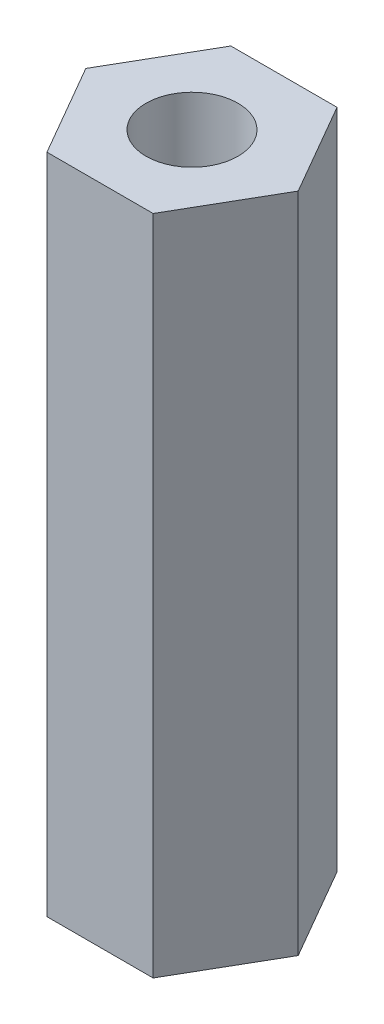
ISO-10303-21;
HEADER;
FILE_DESCRIPTION(('STEP AP214'),'2;1');
FILE_NAME('part.step','',(''),(''),'','','');
FILE_SCHEMA(('AUTOMOTIVE_DESIGN { 1 0 10303 214 1 1 1 1 }'));
ENDSEC;
DATA;
#1=APPLICATION_CONTEXT('core data for automotive mechanical design processes');
#2=APPLICATION_PROTOCOL_DEFINITION('international standard','automotive_design',2000,#1);
#3=PRODUCT_CONTEXT('',#1,'mechanical');
#4=PRODUCT('Part','Part','',(#3));
#5=PRODUCT_RELATED_PRODUCT_CATEGORY('part','',(#4));
#6=PRODUCT_DEFINITION_FORMATION('','',#4);
#7=PRODUCT_DEFINITION_CONTEXT('part definition',#1,'design');
#8=PRODUCT_DEFINITION('design','',#6,#7);
#9=PRODUCT_DEFINITION_SHAPE('','',#8);
#10=(LENGTH_UNIT() NAMED_UNIT(*) SI_UNIT(.MILLI.,.METRE.));
#11=(NAMED_UNIT(*) PLANE_ANGLE_UNIT() SI_UNIT($,.RADIAN.));
#12=(NAMED_UNIT(*) SI_UNIT($,.STERADIAN.) SOLID_ANGLE_UNIT());
#13=UNCERTAINTY_MEASURE_WITH_UNIT(LENGTH_MEASURE(1.E-05),#10,'distance_accuracy_value','');
#14=(GEOMETRIC_REPRESENTATION_CONTEXT(3) GLOBAL_UNCERTAINTY_ASSIGNED_CONTEXT((#13)) GLOBAL_UNIT_ASSIGNED_CONTEXT((#10,
#11,#12)) REPRESENTATION_CONTEXT('',''));
#15=CARTESIAN_POINT('',(0.,0.,0.));
#16=DIRECTION('',(0.,0.,1.));
#17=DIRECTION('',(1.,0.,0.));
#18=AXIS2_PLACEMENT_3D('',#15,#16,#17);
#19=CARTESIAN_POINT('',(0.,18.,0.));
#20=DIRECTION('',(0.,1.,0.));
#21=DIRECTION('',(0.,0.,1.));
#22=AXIS2_PLACEMENT_3D('',#19,#20,#21);
#23=PLANE('',#22);
#24=DIRECTION('',(1.,0.,0.));
#25=VECTOR('',#24,1.);
#26=CARTESIAN_POINT('',(-1.44337567297406,18.,2.5));
#27=LINE('',#26,#25);
#28=CARTESIAN_POINT('',(-1.44337567297406,18.,2.5));
#29=VERTEX_POINT('',#28);
#30=CARTESIAN_POINT('',(1.44337567297406,18.,2.5));
#31=VERTEX_POINT('',#30);
#32=EDGE_CURVE('E137',#29,#31,#27,.T.);
#33=ORIENTED_EDGE('',*,*,#32,.T.);
#34=DIRECTION('',(0.5,0.,-0.866025403784439));
#35=VECTOR('',#34,1.);
#36=CARTESIAN_POINT('',(1.44337567297406,18.,2.5));
#37=LINE('',#36,#35);
#38=CARTESIAN_POINT('',(2.88675134594813,18.,0.));
#39=VERTEX_POINT('',#38);
#40=EDGE_CURVE('E95',#31,#39,#37,.T.);
#41=ORIENTED_EDGE('',*,*,#40,.T.);
#42=DIRECTION('',(-0.5,0.,-0.866025403784438));
#43=VECTOR('',#42,1.);
#44=CARTESIAN_POINT('',(2.88675134594813,18.,0.));
#45=LINE('',#44,#43);
#46=CARTESIAN_POINT('',(1.44337567297406,18.,-2.5));
#47=VERTEX_POINT('',#46);
#48=EDGE_CURVE('E108',#39,#47,#45,.T.);
#49=ORIENTED_EDGE('',*,*,#48,.T.);
#50=DIRECTION('',(-1.,0.,0.));
#51=VECTOR('',#50,1.);
#52=CARTESIAN_POINT('',(1.44337567297406,18.,-2.5));
#53=LINE('',#52,#51);
#54=CARTESIAN_POINT('',(-1.44337567297407,18.,-2.5));
#55=VERTEX_POINT('',#54);
#56=EDGE_CURVE('E102',#47,#55,#53,.T.);
#57=ORIENTED_EDGE('',*,*,#56,.T.);
#58=DIRECTION('',(-0.5,0.,0.866025403784439));
#59=VECTOR('',#58,1.);
#60=CARTESIAN_POINT('',(-1.44337567297407,18.,-2.5));
#61=LINE('',#60,#59);
#62=CARTESIAN_POINT('',(-2.88675134594813,18.,0.));
#63=VERTEX_POINT('',#62);
#64=EDGE_CURVE('E106',#55,#63,#61,.T.);
#65=ORIENTED_EDGE('',*,*,#64,.T.);
#66=DIRECTION('',(0.5,0.,0.866025403784439));
#67=VECTOR('',#66,1.);
#68=CARTESIAN_POINT('',(-2.88675134594813,18.,0.));
#69=LINE('',#68,#67);
#70=EDGE_CURVE('E58',#63,#29,#69,.T.);
#71=ORIENTED_EDGE('',*,*,#70,.T.);
#72=EDGE_LOOP('',(#33,#41,#49,#57,#65,#71));
#73=FACE_BOUND('',#72,.T.);
#74=CARTESIAN_POINT('',(0.,18.,0.));
#75=DIRECTION('',(0.,1.,0.));
#76=DIRECTION('',(0.,0.,1.));
#77=AXIS2_PLACEMENT_3D('',#74,#75,#76);
#78=CIRCLE('',#77,1.25);
#79=CARTESIAN_POINT('',(0.,18.,1.25));
#80=VERTEX_POINT('',#79);
#81=EDGE_CURVE('E130',#80,#80,#78,.T.);
#82=ORIENTED_EDGE('',*,*,#81,.F.);
#83=EDGE_LOOP('',(#82));
#84=FACE_BOUND('',#83,.T.);
#85=ADVANCED_FACE('F41',(#73,#84),#23,.T.);
#86=CARTESIAN_POINT('',(0.,0.,0.));
#87=DIRECTION('',(0.,1.,0.));
#88=DIRECTION('',(0.,0.,1.));
#89=AXIS2_PLACEMENT_3D('',#86,#87,#88);
#90=PLANE('',#89);
#91=DIRECTION('',(1.,0.,0.));
#92=VECTOR('',#91,1.);
#93=CARTESIAN_POINT('',(-1.44337567297406,0.,2.5));
#94=LINE('',#93,#92);
#95=CARTESIAN_POINT('',(-1.44337567297406,0.,2.5));
#96=VERTEX_POINT('',#95);
#97=CARTESIAN_POINT('',(1.44337567297406,0.,2.5));
#98=VERTEX_POINT('',#97);
#99=EDGE_CURVE('E126',#96,#98,#94,.T.);
#100=ORIENTED_EDGE('',*,*,#99,.F.);
#101=DIRECTION('',(0.5,0.,0.866025403784439));
#102=VECTOR('',#101,1.);
#103=CARTESIAN_POINT('',(-2.88675134594813,0.,0.));
#104=LINE('',#103,#102);
#105=CARTESIAN_POINT('',(-2.88675134594813,0.,0.));
#106=VERTEX_POINT('',#105);
#107=EDGE_CURVE('E87',#106,#96,#104,.T.);
#108=ORIENTED_EDGE('',*,*,#107,.F.);
#109=DIRECTION('',(-0.5,0.,0.866025403784439));
#110=VECTOR('',#109,1.);
#111=CARTESIAN_POINT('',(-1.44337567297407,0.,-2.5));
#112=LINE('',#111,#110);
#113=CARTESIAN_POINT('',(-1.44337567297407,0.,-2.5));
#114=VERTEX_POINT('',#113);
#115=EDGE_CURVE('E81',#114,#106,#112,.T.);
#116=ORIENTED_EDGE('',*,*,#115,.F.);
#117=DIRECTION('',(-1.,0.,0.));
#118=VECTOR('',#117,1.);
#119=CARTESIAN_POINT('',(1.44337567297406,0.,-2.5));
#120=LINE('',#119,#118);
#121=CARTESIAN_POINT('',(1.44337567297406,0.,-2.5));
#122=VERTEX_POINT('',#121);
#123=EDGE_CURVE('E116',#122,#114,#120,.T.);
#124=ORIENTED_EDGE('',*,*,#123,.F.);
#125=DIRECTION('',(-0.5,0.,-0.866025403784438));
#126=VECTOR('',#125,1.);
#127=CARTESIAN_POINT('',(2.88675134594813,0.,0.));
#128=LINE('',#127,#126);
#129=CARTESIAN_POINT('',(2.88675134594813,0.,0.));
#130=VERTEX_POINT('',#129);
#131=EDGE_CURVE('E132',#130,#122,#128,.T.);
#132=ORIENTED_EDGE('',*,*,#131,.F.);
#133=DIRECTION('',(0.5,0.,-0.866025403784439));
#134=VECTOR('',#133,1.);
#135=CARTESIAN_POINT('',(1.44337567297406,0.,2.5));
#136=LINE('',#135,#134);
#137=EDGE_CURVE('E129',#98,#130,#136,.T.);
#138=ORIENTED_EDGE('',*,*,#137,.F.);
#139=EDGE_LOOP('',(#100,#108,#116,#124,#132,#138));
#140=FACE_BOUND('',#139,.T.);
#141=CARTESIAN_POINT('',(0.,0.,0.));
#142=DIRECTION('',(0.,1.,0.));
#143=DIRECTION('',(0.,0.,1.));
#144=AXIS2_PLACEMENT_3D('',#141,#142,#143);
#145=CIRCLE('',#144,1.25);
#146=CARTESIAN_POINT('',(0.,0.,1.25));
#147=VERTEX_POINT('',#146);
#148=EDGE_CURVE('E230',#147,#147,#145,.T.);
#149=ORIENTED_EDGE('',*,*,#148,.T.);
#150=EDGE_LOOP('',(#149));
#151=FACE_BOUND('',#150,.T.);
#152=ADVANCED_FACE('F146',(#140,#151),#90,.F.);
#153=CARTESIAN_POINT('',(-1.44337567297406,18.,2.5));
#154=DIRECTION('',(0.,0.,-1.));
#155=DIRECTION('',(-1.,0.,0.));
#156=AXIS2_PLACEMENT_3D('',#153,#154,#155);
#157=PLANE('',#156);
#158=ORIENTED_EDGE('',*,*,#99,.T.);
#159=DIRECTION('',(0.,-1.,0.));
#160=VECTOR('',#159,1.);
#161=CARTESIAN_POINT('',(1.44337567297406,18.,2.5));
#162=LINE('',#161,#160);
#163=EDGE_CURVE('E11',#31,#98,#162,.T.);
#164=ORIENTED_EDGE('',*,*,#163,.F.);
#165=ORIENTED_EDGE('',*,*,#32,.F.);
#166=DIRECTION('',(0.,-1.,0.));
#167=VECTOR('',#166,1.);
#168=CARTESIAN_POINT('',(-1.44337567297406,18.,2.5));
#169=LINE('',#168,#167);
#170=EDGE_CURVE('E122',#29,#96,#169,.T.);
#171=ORIENTED_EDGE('',*,*,#170,.T.);
#172=EDGE_LOOP('',(#158,#164,#165,#171));
#173=FACE_BOUND('',#172,.T.);
#174=ADVANCED_FACE('F43',(#173),#157,.F.);
#175=CARTESIAN_POINT('',(1.44337567297406,18.,2.5));
#176=DIRECTION('',(-0.866025403784439,0.,-0.5));
#177=DIRECTION('',(-0.5,0.,0.866025403784439));
#178=AXIS2_PLACEMENT_3D('',#175,#176,#177);
#179=PLANE('',#178);
#180=ORIENTED_EDGE('',*,*,#137,.T.);
#181=DIRECTION('',(0.,-1.,0.));
#182=VECTOR('',#181,1.);
#183=CARTESIAN_POINT('',(2.88675134594813,18.,0.));
#184=LINE('',#183,#182);
#185=EDGE_CURVE('E50',#39,#130,#184,.T.);
#186=ORIENTED_EDGE('',*,*,#185,.F.);
#187=ORIENTED_EDGE('',*,*,#40,.F.);
#188=ORIENTED_EDGE('',*,*,#163,.T.);
#189=EDGE_LOOP('',(#180,#186,#187,#188));
#190=FACE_BOUND('',#189,.T.);
#191=ADVANCED_FACE('F171',(#190),#179,.F.);
#192=CARTESIAN_POINT('',(2.88675134594813,18.,0.));
#193=DIRECTION('',(-0.866025403784438,0.,0.5));
#194=DIRECTION('',(0.5,0.,0.866025403784438));
#195=AXIS2_PLACEMENT_3D('',#192,#193,#194);
#196=PLANE('',#195);
#197=ORIENTED_EDGE('',*,*,#131,.T.);
#198=DIRECTION('',(0.,-1.,0.));
#199=VECTOR('',#198,1.);
#200=CARTESIAN_POINT('',(1.44337567297406,18.,-2.5));
#201=LINE('',#200,#199);
#202=EDGE_CURVE('E117',#47,#122,#201,.T.);
#203=ORIENTED_EDGE('',*,*,#202,.F.);
#204=ORIENTED_EDGE('',*,*,#48,.F.);
#205=ORIENTED_EDGE('',*,*,#185,.T.);
#206=EDGE_LOOP('',(#197,#203,#204,#205));
#207=FACE_BOUND('',#206,.T.);
#208=ADVANCED_FACE('F143',(#207),#196,.F.);
#209=CARTESIAN_POINT('',(1.44337567297406,18.,-2.5));
#210=DIRECTION('',(0.,0.,1.));
#211=DIRECTION('',(1.,0.,0.));
#212=AXIS2_PLACEMENT_3D('',#209,#210,#211);
#213=PLANE('',#212);
#214=ORIENTED_EDGE('',*,*,#123,.T.);
#215=DIRECTION('',(0.,-1.,0.));
#216=VECTOR('',#215,1.);
#217=CARTESIAN_POINT('',(-1.44337567297407,18.,-2.5));
#218=LINE('',#217,#216);
#219=EDGE_CURVE('E113',#55,#114,#218,.T.);
#220=ORIENTED_EDGE('',*,*,#219,.F.);
#221=ORIENTED_EDGE('',*,*,#56,.F.);
#222=ORIENTED_EDGE('',*,*,#202,.T.);
#223=EDGE_LOOP('',(#214,#220,#221,#222));
#224=FACE_BOUND('',#223,.T.);
#225=ADVANCED_FACE('F114',(#224),#213,.F.);
#226=CARTESIAN_POINT('',(-1.44337567297407,18.,-2.5));
#227=DIRECTION('',(0.866025403784439,0.,0.5));
#228=DIRECTION('',(0.5,0.,-0.866025403784439));
#229=AXIS2_PLACEMENT_3D('',#226,#227,#228);
#230=PLANE('',#229);
#231=ORIENTED_EDGE('',*,*,#115,.T.);
#232=DIRECTION('',(0.,-1.,0.));
#233=VECTOR('',#232,1.);
#234=CARTESIAN_POINT('',(-2.88675134594813,18.,0.));
#235=LINE('',#234,#233);
#236=EDGE_CURVE('E118',#63,#106,#235,.T.);
#237=ORIENTED_EDGE('',*,*,#236,.F.);
#238=ORIENTED_EDGE('',*,*,#64,.F.);
#239=ORIENTED_EDGE('',*,*,#219,.T.);
#240=EDGE_LOOP('',(#231,#237,#238,#239));
#241=FACE_BOUND('',#240,.T.);
#242=ADVANCED_FACE('F120',(#241),#230,.F.);
#243=CARTESIAN_POINT('',(-2.88675134594813,18.,0.));
#244=DIRECTION('',(0.866025403784438,0.,-0.5));
#245=DIRECTION('',(-0.5,0.,-0.866025403784439));
#246=AXIS2_PLACEMENT_3D('',#243,#244,#245);
#247=PLANE('',#246);
#248=ORIENTED_EDGE('',*,*,#107,.T.);
#249=ORIENTED_EDGE('',*,*,#170,.F.);
#250=ORIENTED_EDGE('',*,*,#70,.F.);
#251=ORIENTED_EDGE('',*,*,#236,.T.);
#252=EDGE_LOOP('',(#248,#249,#250,#251));
#253=FACE_BOUND('',#252,.T.);
#254=ADVANCED_FACE('F151',(#253),#247,.F.);
#255=CARTESIAN_POINT('',(0.,18.,0.));
#256=DIRECTION('',(0.,-1.,0.));
#257=DIRECTION('',(0.,0.,-1.));
#258=AXIS2_PLACEMENT_3D('',#255,#256,#257);
#259=CYLINDRICAL_SURFACE('',#258,1.25);
#260=ORIENTED_EDGE('',*,*,#81,.T.);
#261=EDGE_LOOP('',(#260));
#262=FACE_BOUND('',#261,.T.);
#263=ORIENTED_EDGE('',*,*,#148,.F.);
#264=EDGE_LOOP('',(#263));
#265=FACE_BOUND('',#264,.T.);
#266=ADVANCED_FACE('F153',(#262,#265),#259,.F.);
#267=CLOSED_SHELL('',(#85,#152,#174,#191,#208,#225,#242,#254,#266));
#268=MANIFOLD_SOLID_BREP('B2',#267);
#269=ADVANCED_BREP_SHAPE_REPRESENTATION('',(#18,#268),#14);
#270=SHAPE_DEFINITION_REPRESENTATION(#9,#269);
ENDSEC;
END-ISO-10303-21;
